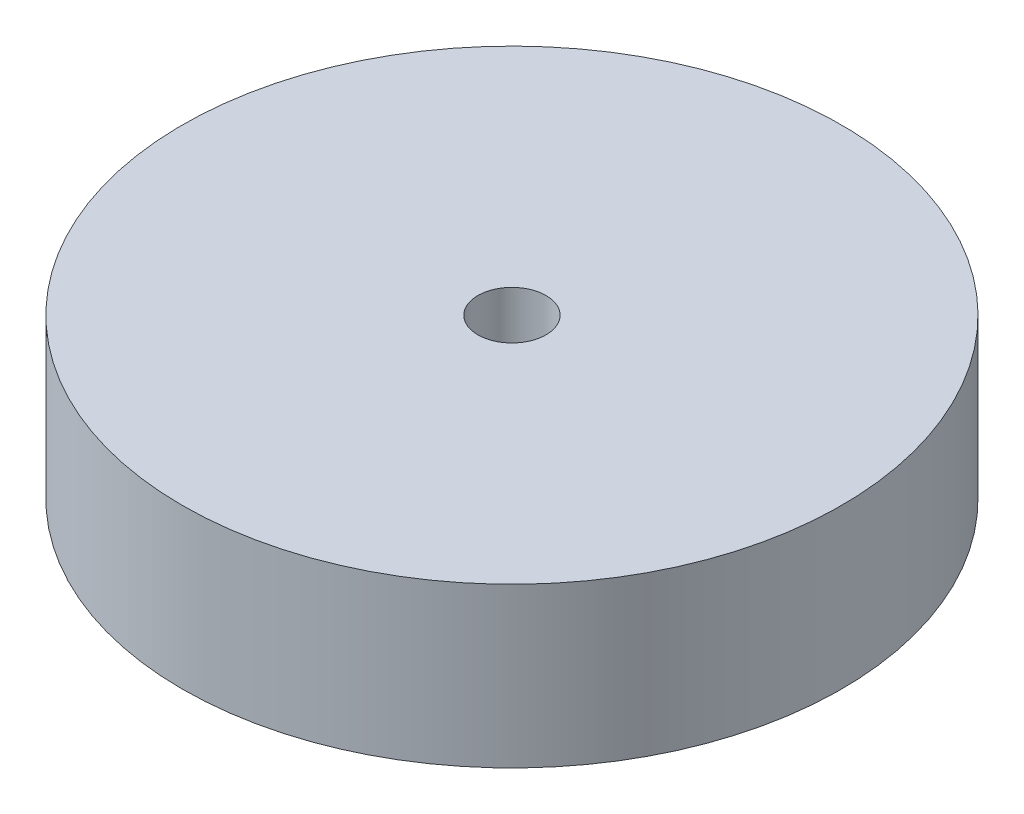
ISO-10303-21;
HEADER;
FILE_DESCRIPTION(('STEP AP214'),'2;1');
FILE_NAME('part.step','',(''),(''),'','','');
FILE_SCHEMA(('AUTOMOTIVE_DESIGN { 1 0 10303 214 1 1 1 1 }'));
ENDSEC;
DATA;
#1=APPLICATION_CONTEXT('core data for automotive mechanical design processes');
#2=APPLICATION_PROTOCOL_DEFINITION('international standard','automotive_design',2000,#1);
#3=PRODUCT_CONTEXT('',#1,'mechanical');
#4=PRODUCT('Part','Part','',(#3));
#5=PRODUCT_RELATED_PRODUCT_CATEGORY('part','',(#4));
#6=PRODUCT_DEFINITION_FORMATION('','',#4);
#7=PRODUCT_DEFINITION_CONTEXT('part definition',#1,'design');
#8=PRODUCT_DEFINITION('design','',#6,#7);
#9=PRODUCT_DEFINITION_SHAPE('','',#8);
#10=(LENGTH_UNIT() NAMED_UNIT(*) SI_UNIT(.MILLI.,.METRE.));
#11=(NAMED_UNIT(*) PLANE_ANGLE_UNIT() SI_UNIT($,.RADIAN.));
#12=(NAMED_UNIT(*) SI_UNIT($,.STERADIAN.) SOLID_ANGLE_UNIT());
#13=UNCERTAINTY_MEASURE_WITH_UNIT(LENGTH_MEASURE(1.E-05),#10,'distance_accuracy_value','');
#14=(GEOMETRIC_REPRESENTATION_CONTEXT(3) GLOBAL_UNCERTAINTY_ASSIGNED_CONTEXT((#13)) GLOBAL_UNIT_ASSIGNED_CONTEXT((#10,
#11,#12)) REPRESENTATION_CONTEXT('',''));
#15=CARTESIAN_POINT('',(0.,0.,0.));
#16=DIRECTION('',(0.,0.,1.));
#17=DIRECTION('',(1.,0.,0.));
#18=AXIS2_PLACEMENT_3D('',#15,#16,#17);
#19=CARTESIAN_POINT('',(0.,14.,0.));
#20=DIRECTION('',(0.,1.,0.));
#21=DIRECTION('',(0.,0.,1.));
#22=AXIS2_PLACEMENT_3D('',#19,#20,#21);
#23=PLANE('',#22);
#24=CARTESIAN_POINT('',(0.,14.,0.));
#25=DIRECTION('',(0.,1.,0.));
#26=DIRECTION('',(0.,0.,1.));
#27=AXIS2_PLACEMENT_3D('',#24,#25,#26);
#28=CIRCLE('',#27,29.);
#29=CARTESIAN_POINT('',(0.,14.,29.));
#30=VERTEX_POINT('',#29);
#31=EDGE_CURVE('E10',#30,#30,#28,.T.);
#32=ORIENTED_EDGE('',*,*,#31,.T.);
#33=EDGE_LOOP('',(#32));
#34=FACE_BOUND('',#33,.T.);
#35=CARTESIAN_POINT('',(0.,14.,0.));
#36=DIRECTION('',(0.,1.,0.));
#37=DIRECTION('',(0.,0.,1.));
#38=AXIS2_PLACEMENT_3D('',#35,#36,#37);
#39=CIRCLE('',#38,3.);
#40=CARTESIAN_POINT('',(0.,14.,3.));
#41=VERTEX_POINT('',#40);
#42=EDGE_CURVE('E42',#41,#41,#39,.T.);
#43=ORIENTED_EDGE('',*,*,#42,.F.);
#44=EDGE_LOOP('',(#43));
#45=FACE_BOUND('',#44,.T.);
#46=ADVANCED_FACE('F31',(#34,#45),#23,.T.);
#47=CARTESIAN_POINT('',(0.,0.,0.));
#48=DIRECTION('',(0.,1.,0.));
#49=DIRECTION('',(0.,0.,1.));
#50=AXIS2_PLACEMENT_3D('',#47,#48,#49);
#51=PLANE('',#50);
#52=CARTESIAN_POINT('',(0.,0.,0.));
#53=DIRECTION('',(0.,1.,0.));
#54=DIRECTION('',(0.,0.,1.));
#55=AXIS2_PLACEMENT_3D('',#52,#53,#54);
#56=CIRCLE('',#55,29.);
#57=CARTESIAN_POINT('',(0.,0.,29.));
#58=VERTEX_POINT('',#57);
#59=EDGE_CURVE('E35',#58,#58,#56,.T.);
#60=ORIENTED_EDGE('',*,*,#59,.F.);
#61=EDGE_LOOP('',(#60));
#62=FACE_BOUND('',#61,.T.);
#63=CARTESIAN_POINT('',(0.,0.,0.));
#64=DIRECTION('',(0.,1.,0.));
#65=DIRECTION('',(0.,0.,1.));
#66=AXIS2_PLACEMENT_3D('',#63,#64,#65);
#67=CIRCLE('',#66,3.);
#68=CARTESIAN_POINT('',(0.,0.,3.));
#69=VERTEX_POINT('',#68);
#70=EDGE_CURVE('E44',#69,#69,#67,.T.);
#71=ORIENTED_EDGE('',*,*,#70,.T.);
#72=EDGE_LOOP('',(#71));
#73=FACE_BOUND('',#72,.T.);
#74=ADVANCED_FACE('F54',(#62,#73),#51,.F.);
#75=CARTESIAN_POINT('',(0.,14.,0.));
#76=DIRECTION('',(0.,-1.,0.));
#77=DIRECTION('',(0.,0.,-1.));
#78=AXIS2_PLACEMENT_3D('',#75,#76,#77);
#79=CYLINDRICAL_SURFACE('',#78,29.);
#80=ORIENTED_EDGE('',*,*,#31,.F.);
#81=EDGE_LOOP('',(#80));
#82=FACE_BOUND('',#81,.T.);
#83=ORIENTED_EDGE('',*,*,#59,.T.);
#84=EDGE_LOOP('',(#83));
#85=FACE_BOUND('',#84,.T.);
#86=ADVANCED_FACE('F33',(#82,#85),#79,.T.);
#87=CARTESIAN_POINT('',(0.,14.,0.));
#88=DIRECTION('',(0.,-1.,0.));
#89=DIRECTION('',(0.,0.,-1.));
#90=AXIS2_PLACEMENT_3D('',#87,#88,#89);
#91=CYLINDRICAL_SURFACE('',#90,3.);
#92=ORIENTED_EDGE('',*,*,#42,.T.);
#93=EDGE_LOOP('',(#92));
#94=FACE_BOUND('',#93,.T.);
#95=ORIENTED_EDGE('',*,*,#70,.F.);
#96=EDGE_LOOP('',(#95));
#97=FACE_BOUND('',#96,.T.);
#98=ADVANCED_FACE('F50',(#94,#97),#91,.F.);
#99=CLOSED_SHELL('',(#46,#74,#86,#98));
#100=MANIFOLD_SOLID_BREP('B2',#99);
#101=ADVANCED_BREP_SHAPE_REPRESENTATION('',(#18,#100),#14);
#102=SHAPE_DEFINITION_REPRESENTATION(#9,#101);
ENDSEC;
END-ISO-10303-21;
